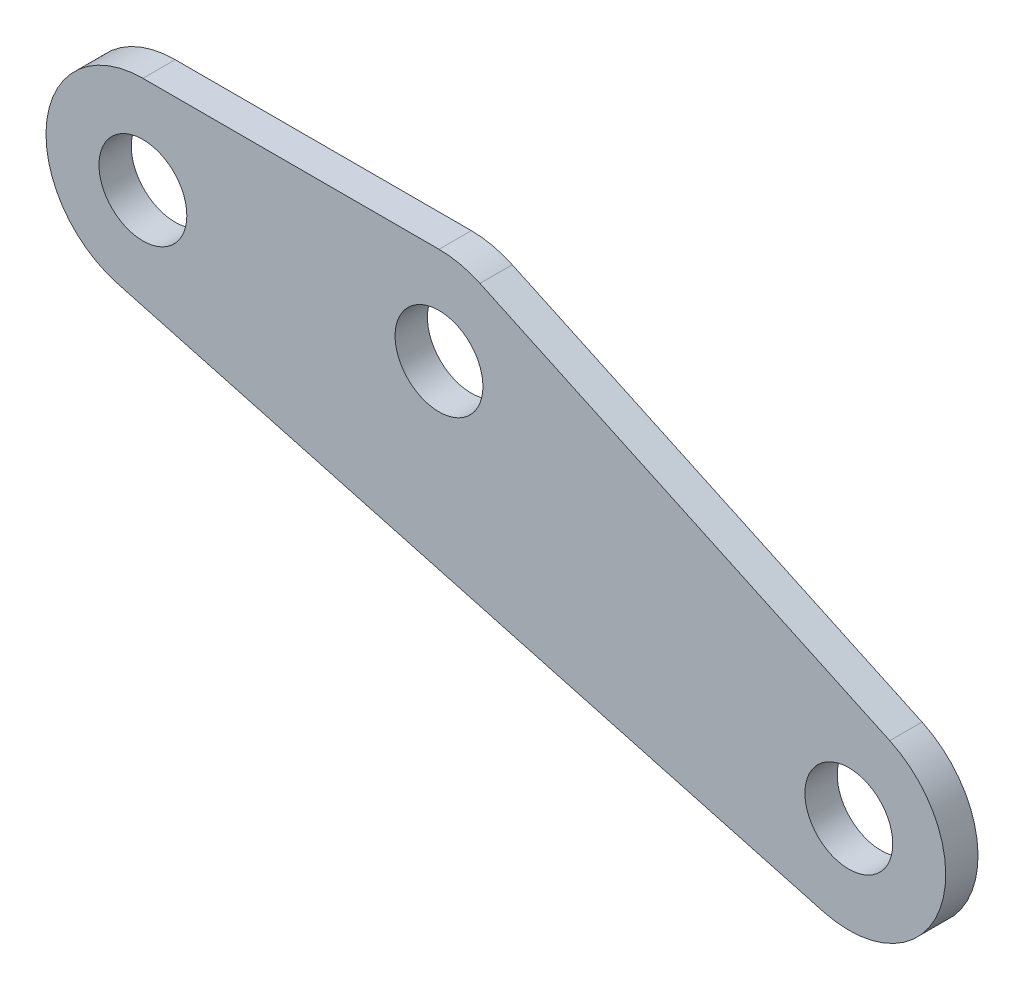
ISO-10303-21;
HEADER;
FILE_DESCRIPTION(('STEP AP214'),'2;1');
FILE_NAME('part.step','',(''),(''),'','','');
FILE_SCHEMA(('AUTOMOTIVE_DESIGN { 1 0 10303 214 1 1 1 1 }'));
ENDSEC;
DATA;
#1=APPLICATION_CONTEXT('core data for automotive mechanical design processes');
#2=APPLICATION_PROTOCOL_DEFINITION('international standard','automotive_design',2000,#1);
#3=PRODUCT_CONTEXT('',#1,'mechanical');
#4=PRODUCT('Part','Part','',(#3));
#5=PRODUCT_RELATED_PRODUCT_CATEGORY('part','',(#4));
#6=PRODUCT_DEFINITION_FORMATION('','',#4);
#7=PRODUCT_DEFINITION_CONTEXT('part definition',#1,'design');
#8=PRODUCT_DEFINITION('design','',#6,#7);
#9=PRODUCT_DEFINITION_SHAPE('','',#8);
#10=(LENGTH_UNIT() NAMED_UNIT(*) SI_UNIT(.MILLI.,.METRE.));
#11=(NAMED_UNIT(*) PLANE_ANGLE_UNIT() SI_UNIT($,.RADIAN.));
#12=(NAMED_UNIT(*) SI_UNIT($,.STERADIAN.) SOLID_ANGLE_UNIT());
#13=UNCERTAINTY_MEASURE_WITH_UNIT(LENGTH_MEASURE(1.E-05),#10,'distance_accuracy_value','');
#14=(GEOMETRIC_REPRESENTATION_CONTEXT(3) GLOBAL_UNCERTAINTY_ASSIGNED_CONTEXT((#13)) GLOBAL_UNIT_ASSIGNED_CONTEXT((#10,
#11,#12)) REPRESENTATION_CONTEXT('',''));
#15=CARTESIAN_POINT('',(0.,0.,0.));
#16=DIRECTION('',(0.,0.,1.));
#17=DIRECTION('',(1.,0.,0.));
#18=AXIS2_PLACEMENT_3D('',#15,#16,#17);
#19=CARTESIAN_POINT('',(14.5542,0.,1.5875));
#20=DIRECTION('',(0.,0.,1.));
#21=DIRECTION('',(1.,0.,0.));
#22=AXIS2_PLACEMENT_3D('',#19,#20,#21);
#23=PLANE('',#22);
#24=CARTESIAN_POINT('',(14.5542,0.,1.5875));
#25=DIRECTION('',(0.,0.,1.));
#26=DIRECTION('',(1.,0.,0.));
#27=AXIS2_PLACEMENT_3D('',#24,#25,#26);
#28=CIRCLE('',#27,2.159);
#29=CARTESIAN_POINT('',(16.7132,0.,1.5875));
#30=VERTEX_POINT('',#29);
#31=EDGE_CURVE('E227',#30,#30,#28,.T.);
#32=ORIENTED_EDGE('',*,*,#31,.F.);
#33=EDGE_LOOP('',(#32));
#34=FACE_BOUND('',#33,.T.);
#35=CARTESIAN_POINT('',(14.5542,0.,1.5875));
#36=DIRECTION('',(0.,0.,1.));
#37=DIRECTION('',(1.,0.,0.));
#38=AXIS2_PLACEMENT_3D('',#35,#36,#37);
#39=CIRCLE('',#38,4.7625);
#40=CARTESIAN_POINT('',(16.5669194715401,4.31629083576206,1.5875));
#41=VERTEX_POINT('',#40);
#42=CARTESIAN_POINT('',(14.5542,4.7625,1.5875));
#43=VERTEX_POINT('',#42);
#44=EDGE_CURVE('E168',#41,#43,#39,.T.);
#45=ORIENTED_EDGE('',*,*,#44,.T.);
#46=DIRECTION('',(-1.,0.,0.));
#47=VECTOR('',#46,1.);
#48=CARTESIAN_POINT('',(14.5542,4.7625,1.5875));
#49=LINE('',#48,#47);
#50=CARTESIAN_POINT('',(0.,4.7625,1.5875));
#51=VERTEX_POINT('',#50);
#52=EDGE_CURVE('E114',#43,#51,#49,.T.);
#53=ORIENTED_EDGE('',*,*,#52,.T.);
#54=CARTESIAN_POINT('',(0.,0.,1.5875));
#55=DIRECTION('',(0.,0.,1.));
#56=DIRECTION('',(1.,0.,0.));
#57=AXIS2_PLACEMENT_3D('',#54,#55,#56);
#58=CIRCLE('',#57,4.7625);
#59=CARTESIAN_POINT('',(-1.24445008795971,-4.59703711411786,1.5875));
#60=VERTEX_POINT('',#59);
#61=EDGE_CURVE('E129',#51,#60,#58,.T.);
#62=ORIENTED_EDGE('',*,*,#61,.T.);
#63=DIRECTION('',(0.965257136822648,-0.261301855739571,0.));
#64=VECTOR('',#63,1.);
#65=CARTESIAN_POINT('',(-1.24445008795971,-4.59703711411786,1.5875));
#66=LINE('',#65,#64);
#67=CARTESIAN_POINT('',(33.4524404789299,-13.9897279813048,1.5875));
#68=VERTEX_POINT('',#67);
#69=EDGE_CURVE('E123',#60,#68,#66,.T.);
#70=ORIENTED_EDGE('',*,*,#69,.T.);
#71=CARTESIAN_POINT('',(34.6968905668896,-9.39269086718691,1.5875));
#72=DIRECTION('',(0.,0.,1.));
#73=DIRECTION('',(1.,0.,0.));
#74=AXIS2_PLACEMENT_3D('',#71,#72,#73);
#75=CIRCLE('',#74,4.7625);
#76=CARTESIAN_POINT('',(36.7096100384297,-5.07640003142486,1.5875));
#77=VERTEX_POINT('',#76);
#78=EDGE_CURVE('E127',#68,#77,#75,.T.);
#79=ORIENTED_EDGE('',*,*,#78,.T.);
#80=DIRECTION('',(-0.906307787036653,0.422618261740693,0.));
#81=VECTOR('',#80,1.);
#82=CARTESIAN_POINT('',(16.5669194715401,4.31629083576206,1.5875));
#83=LINE('',#82,#81);
#84=EDGE_CURVE('E69',#77,#41,#83,.T.);
#85=ORIENTED_EDGE('',*,*,#84,.T.);
#86=EDGE_LOOP('',(#45,#53,#62,#70,#79,#85));
#87=FACE_BOUND('',#86,.T.);
#88=CARTESIAN_POINT('',(0.,0.,1.5875));
#89=DIRECTION('',(0.,0.,1.));
#90=DIRECTION('',(1.,0.,0.));
#91=AXIS2_PLACEMENT_3D('',#88,#89,#90);
#92=CIRCLE('',#91,2.159);
#93=CARTESIAN_POINT('',(2.159,0.,1.5875));
#94=VERTEX_POINT('',#93);
#95=EDGE_CURVE('E156',#94,#94,#92,.T.);
#96=ORIENTED_EDGE('',*,*,#95,.F.);
#97=EDGE_LOOP('',(#96));
#98=FACE_BOUND('',#97,.T.);
#99=CARTESIAN_POINT('',(34.6968905668896,-9.39269086718691,1.5875));
#100=DIRECTION('',(0.,0.,1.));
#101=DIRECTION('',(1.,0.,0.));
#102=AXIS2_PLACEMENT_3D('',#99,#100,#101);
#103=CIRCLE('',#102,2.159);
#104=CARTESIAN_POINT('',(36.8558905668896,-9.39269086718691,1.5875));
#105=VERTEX_POINT('',#104);
#106=EDGE_CURVE('E216',#105,#105,#103,.T.);
#107=ORIENTED_EDGE('',*,*,#106,.F.);
#108=EDGE_LOOP('',(#107));
#109=FACE_BOUND('',#108,.T.);
#110=ADVANCED_FACE('F49',(#34,#87,#98,#109),#23,.T.);
#111=CARTESIAN_POINT('',(14.5542,0.,0.));
#112=DIRECTION('',(0.,0.,1.));
#113=DIRECTION('',(1.,0.,0.));
#114=AXIS2_PLACEMENT_3D('',#111,#112,#113);
#115=PLANE('',#114);
#116=CARTESIAN_POINT('',(14.5542,0.,0.));
#117=DIRECTION('',(0.,0.,1.));
#118=DIRECTION('',(1.,0.,0.));
#119=AXIS2_PLACEMENT_3D('',#116,#117,#118);
#120=CIRCLE('',#119,4.7625);
#121=CARTESIAN_POINT('',(16.5669194715401,4.31629083576206,0.));
#122=VERTEX_POINT('',#121);
#123=CARTESIAN_POINT('',(14.5542,4.7625,0.));
#124=VERTEX_POINT('',#123);
#125=EDGE_CURVE('E151',#122,#124,#120,.T.);
#126=ORIENTED_EDGE('',*,*,#125,.F.);
#127=DIRECTION('',(-0.906307787036653,0.422618261740693,0.));
#128=VECTOR('',#127,1.);
#129=CARTESIAN_POINT('',(16.5669194715401,4.31629083576206,0.));
#130=LINE('',#129,#128);
#131=CARTESIAN_POINT('',(36.7096100384297,-5.07640003142486,0.));
#132=VERTEX_POINT('',#131);
#133=EDGE_CURVE('E106',#132,#122,#130,.T.);
#134=ORIENTED_EDGE('',*,*,#133,.F.);
#135=CARTESIAN_POINT('',(34.6968905668896,-9.39269086718691,0.));
#136=DIRECTION('',(0.,0.,1.));
#137=DIRECTION('',(1.,0.,0.));
#138=AXIS2_PLACEMENT_3D('',#135,#136,#137);
#139=CIRCLE('',#138,4.7625);
#140=CARTESIAN_POINT('',(33.4524404789299,-13.9897279813048,0.));
#141=VERTEX_POINT('',#140);
#142=EDGE_CURVE('E99',#141,#132,#139,.T.);
#143=ORIENTED_EDGE('',*,*,#142,.F.);
#144=DIRECTION('',(0.965257136822648,-0.261301855739571,0.));
#145=VECTOR('',#144,1.);
#146=CARTESIAN_POINT('',(-1.24445008795971,-4.59703711411786,0.));
#147=LINE('',#146,#145);
#148=CARTESIAN_POINT('',(-1.24445008795971,-4.59703711411786,0.));
#149=VERTEX_POINT('',#148);
#150=EDGE_CURVE('E138',#149,#141,#147,.T.);
#151=ORIENTED_EDGE('',*,*,#150,.F.);
#152=CARTESIAN_POINT('',(0.,0.,0.));
#153=DIRECTION('',(0.,0.,1.));
#154=DIRECTION('',(1.,0.,0.));
#155=AXIS2_PLACEMENT_3D('',#152,#153,#154);
#156=CIRCLE('',#155,4.7625);
#157=CARTESIAN_POINT('',(0.,4.7625,0.));
#158=VERTEX_POINT('',#157);
#159=EDGE_CURVE('E159',#158,#149,#156,.T.);
#160=ORIENTED_EDGE('',*,*,#159,.F.);
#161=DIRECTION('',(-1.,0.,0.));
#162=VECTOR('',#161,1.);
#163=CARTESIAN_POINT('',(14.5542,4.7625,0.));
#164=LINE('',#163,#162);
#165=EDGE_CURVE('E155',#124,#158,#164,.T.);
#166=ORIENTED_EDGE('',*,*,#165,.F.);
#167=EDGE_LOOP('',(#126,#134,#143,#151,#160,#166));
#168=FACE_BOUND('',#167,.T.);
#169=CARTESIAN_POINT('',(0.,0.,0.));
#170=DIRECTION('',(0.,0.,1.));
#171=DIRECTION('',(1.,0.,0.));
#172=AXIS2_PLACEMENT_3D('',#169,#170,#171);
#173=CIRCLE('',#172,2.159);
#174=CARTESIAN_POINT('',(2.159,0.,0.));
#175=VERTEX_POINT('',#174);
#176=EDGE_CURVE('E231',#175,#175,#173,.T.);
#177=ORIENTED_EDGE('',*,*,#176,.T.);
#178=EDGE_LOOP('',(#177));
#179=FACE_BOUND('',#178,.T.);
#180=CARTESIAN_POINT('',(14.5542,0.,0.));
#181=DIRECTION('',(0.,0.,1.));
#182=DIRECTION('',(1.,0.,0.));
#183=AXIS2_PLACEMENT_3D('',#180,#181,#182);
#184=CIRCLE('',#183,2.159);
#185=CARTESIAN_POINT('',(16.7132,0.,0.));
#186=VERTEX_POINT('',#185);
#187=EDGE_CURVE('E224',#186,#186,#184,.T.);
#188=ORIENTED_EDGE('',*,*,#187,.T.);
#189=EDGE_LOOP('',(#188));
#190=FACE_BOUND('',#189,.T.);
#191=CARTESIAN_POINT('',(34.6968905668896,-9.39269086718691,0.));
#192=DIRECTION('',(0.,0.,1.));
#193=DIRECTION('',(1.,0.,0.));
#194=AXIS2_PLACEMENT_3D('',#191,#192,#193);
#195=CIRCLE('',#194,2.159);
#196=CARTESIAN_POINT('',(36.8558905668896,-9.39269086718691,0.));
#197=VERTEX_POINT('',#196);
#198=EDGE_CURVE('E219',#197,#197,#195,.T.);
#199=ORIENTED_EDGE('',*,*,#198,.T.);
#200=EDGE_LOOP('',(#199));
#201=FACE_BOUND('',#200,.T.);
#202=ADVANCED_FACE('F181',(#168,#179,#190,#201),#115,.F.);
#203=CARTESIAN_POINT('',(14.5542,0.,1.5875));
#204=DIRECTION('',(0.,0.,-1.));
#205=DIRECTION('',(-1.,0.,0.));
#206=AXIS2_PLACEMENT_3D('',#203,#204,#205);
#207=CYLINDRICAL_SURFACE('',#206,4.7625);
#208=ORIENTED_EDGE('',*,*,#125,.T.);
#209=DIRECTION('',(0.,0.,-1.));
#210=VECTOR('',#209,1.);
#211=CARTESIAN_POINT('',(14.5542,4.7625,1.5875));
#212=LINE('',#211,#210);
#213=EDGE_CURVE('E11',#43,#124,#212,.T.);
#214=ORIENTED_EDGE('',*,*,#213,.F.);
#215=ORIENTED_EDGE('',*,*,#44,.F.);
#216=DIRECTION('',(0.,0.,-1.));
#217=VECTOR('',#216,1.);
#218=CARTESIAN_POINT('',(16.5669194715401,4.31629083576206,1.5875));
#219=LINE('',#218,#217);
#220=EDGE_CURVE('E147',#41,#122,#219,.T.);
#221=ORIENTED_EDGE('',*,*,#220,.T.);
#222=EDGE_LOOP('',(#208,#214,#215,#221));
#223=FACE_BOUND('',#222,.T.);
#224=ADVANCED_FACE('F51',(#223),#207,.T.);
#225=CARTESIAN_POINT('',(14.5542,4.7625,1.5875));
#226=DIRECTION('',(0.,-1.,0.));
#227=DIRECTION('',(1.,0.,0.));
#228=AXIS2_PLACEMENT_3D('',#225,#226,#227);
#229=PLANE('',#228);
#230=ORIENTED_EDGE('',*,*,#165,.T.);
#231=DIRECTION('',(0.,0.,-1.));
#232=VECTOR('',#231,1.);
#233=CARTESIAN_POINT('',(0.,4.7625,1.5875));
#234=LINE('',#233,#232);
#235=EDGE_CURVE('E59',#51,#158,#234,.T.);
#236=ORIENTED_EDGE('',*,*,#235,.F.);
#237=ORIENTED_EDGE('',*,*,#52,.F.);
#238=ORIENTED_EDGE('',*,*,#213,.T.);
#239=EDGE_LOOP('',(#230,#236,#237,#238));
#240=FACE_BOUND('',#239,.T.);
#241=ADVANCED_FACE('F282',(#240),#229,.F.);
#242=CARTESIAN_POINT('',(0.,0.,1.5875));
#243=DIRECTION('',(0.,0.,-1.));
#244=DIRECTION('',(-1.,0.,0.));
#245=AXIS2_PLACEMENT_3D('',#242,#243,#244);
#246=CYLINDRICAL_SURFACE('',#245,4.7625);
#247=ORIENTED_EDGE('',*,*,#159,.T.);
#248=DIRECTION('',(0.,0.,-1.));
#249=VECTOR('',#248,1.);
#250=CARTESIAN_POINT('',(-1.24445008795971,-4.59703711411786,1.5875));
#251=LINE('',#250,#249);
#252=EDGE_CURVE('E140',#60,#149,#251,.T.);
#253=ORIENTED_EDGE('',*,*,#252,.F.);
#254=ORIENTED_EDGE('',*,*,#61,.F.);
#255=ORIENTED_EDGE('',*,*,#235,.T.);
#256=EDGE_LOOP('',(#247,#253,#254,#255));
#257=FACE_BOUND('',#256,.T.);
#258=ADVANCED_FACE('F178',(#257),#246,.T.);
#259=CARTESIAN_POINT('',(-1.24445008795971,-4.59703711411786,1.5875));
#260=DIRECTION('',(0.261301855739571,0.965257136822648,0.));
#261=DIRECTION('',(-0.965257136822648,0.261301855739571,0.));
#262=AXIS2_PLACEMENT_3D('',#259,#260,#261);
#263=PLANE('',#262);
#264=ORIENTED_EDGE('',*,*,#150,.T.);
#265=DIRECTION('',(0.,0.,-1.));
#266=VECTOR('',#265,1.);
#267=CARTESIAN_POINT('',(33.4524404789299,-13.9897279813048,1.5875));
#268=LINE('',#267,#266);
#269=EDGE_CURVE('E135',#68,#141,#268,.T.);
#270=ORIENTED_EDGE('',*,*,#269,.F.);
#271=ORIENTED_EDGE('',*,*,#69,.F.);
#272=ORIENTED_EDGE('',*,*,#252,.T.);
#273=EDGE_LOOP('',(#264,#270,#271,#272));
#274=FACE_BOUND('',#273,.T.);
#275=ADVANCED_FACE('F136',(#274),#263,.F.);
#276=CARTESIAN_POINT('',(34.6968905668896,-9.39269086718691,1.5875));
#277=DIRECTION('',(0.,0.,-1.));
#278=DIRECTION('',(-1.,0.,0.));
#279=AXIS2_PLACEMENT_3D('',#276,#277,#278);
#280=CYLINDRICAL_SURFACE('',#279,4.7625);
#281=ORIENTED_EDGE('',*,*,#142,.T.);
#282=DIRECTION('',(0.,0.,-1.));
#283=VECTOR('',#282,1.);
#284=CARTESIAN_POINT('',(36.7096100384297,-5.07640003142486,1.5875));
#285=LINE('',#284,#283);
#286=EDGE_CURVE('E141',#77,#132,#285,.T.);
#287=ORIENTED_EDGE('',*,*,#286,.F.);
#288=ORIENTED_EDGE('',*,*,#78,.F.);
#289=ORIENTED_EDGE('',*,*,#269,.T.);
#290=EDGE_LOOP('',(#281,#287,#288,#289));
#291=FACE_BOUND('',#290,.T.);
#292=ADVANCED_FACE('F143',(#291),#280,.T.);
#293=CARTESIAN_POINT('',(16.5669194715401,4.31629083576206,1.5875));
#294=DIRECTION('',(-0.422618261740693,-0.906307787036653,0.));
#295=DIRECTION('',(0.906307787036653,-0.422618261740693,0.));
#296=AXIS2_PLACEMENT_3D('',#293,#294,#295);
#297=PLANE('',#296);
#298=ORIENTED_EDGE('',*,*,#133,.T.);
#299=ORIENTED_EDGE('',*,*,#220,.F.);
#300=ORIENTED_EDGE('',*,*,#84,.F.);
#301=ORIENTED_EDGE('',*,*,#286,.T.);
#302=EDGE_LOOP('',(#298,#299,#300,#301));
#303=FACE_BOUND('',#302,.T.);
#304=ADVANCED_FACE('F186',(#303),#297,.F.);
#305=CARTESIAN_POINT('',(0.,0.,1.5875));
#306=DIRECTION('',(0.,0.,-1.));
#307=DIRECTION('',(-1.,0.,0.));
#308=AXIS2_PLACEMENT_3D('',#305,#306,#307);
#309=CYLINDRICAL_SURFACE('',#308,2.159);
#310=ORIENTED_EDGE('',*,*,#95,.T.);
#311=EDGE_LOOP('',(#310));
#312=FACE_BOUND('',#311,.T.);
#313=ORIENTED_EDGE('',*,*,#176,.F.);
#314=EDGE_LOOP('',(#313));
#315=FACE_BOUND('',#314,.T.);
#316=ADVANCED_FACE('F188',(#312,#315),#309,.F.);
#317=CARTESIAN_POINT('',(14.5542,0.,1.5875));
#318=DIRECTION('',(0.,0.,-1.));
#319=DIRECTION('',(-1.,0.,0.));
#320=AXIS2_PLACEMENT_3D('',#317,#318,#319);
#321=CYLINDRICAL_SURFACE('',#320,2.159);
#322=ORIENTED_EDGE('',*,*,#31,.T.);
#323=EDGE_LOOP('',(#322));
#324=FACE_BOUND('',#323,.T.);
#325=ORIENTED_EDGE('',*,*,#187,.F.);
#326=EDGE_LOOP('',(#325));
#327=FACE_BOUND('',#326,.T.);
#328=ADVANCED_FACE('F194',(#324,#327),#321,.F.);
#329=CARTESIAN_POINT('',(34.6968905668896,-9.39269086718691,1.5875));
#330=DIRECTION('',(0.,0.,-1.));
#331=DIRECTION('',(-1.,0.,0.));
#332=AXIS2_PLACEMENT_3D('',#329,#330,#331);
#333=CYLINDRICAL_SURFACE('',#332,2.159);
#334=ORIENTED_EDGE('',*,*,#106,.T.);
#335=EDGE_LOOP('',(#334));
#336=FACE_BOUND('',#335,.T.);
#337=ORIENTED_EDGE('',*,*,#198,.F.);
#338=EDGE_LOOP('',(#337));
#339=FACE_BOUND('',#338,.T.);
#340=ADVANCED_FACE('F209',(#336,#339),#333,.F.);
#341=CLOSED_SHELL('',(#110,#202,#224,#241,#258,#275,#292,#304,#316,#328,#340));
#342=MANIFOLD_SOLID_BREP('B2',#341);
#343=ADVANCED_BREP_SHAPE_REPRESENTATION('',(#18,#342),#14);
#344=SHAPE_DEFINITION_REPRESENTATION(#9,#343);
ENDSEC;
END-ISO-10303-21;
